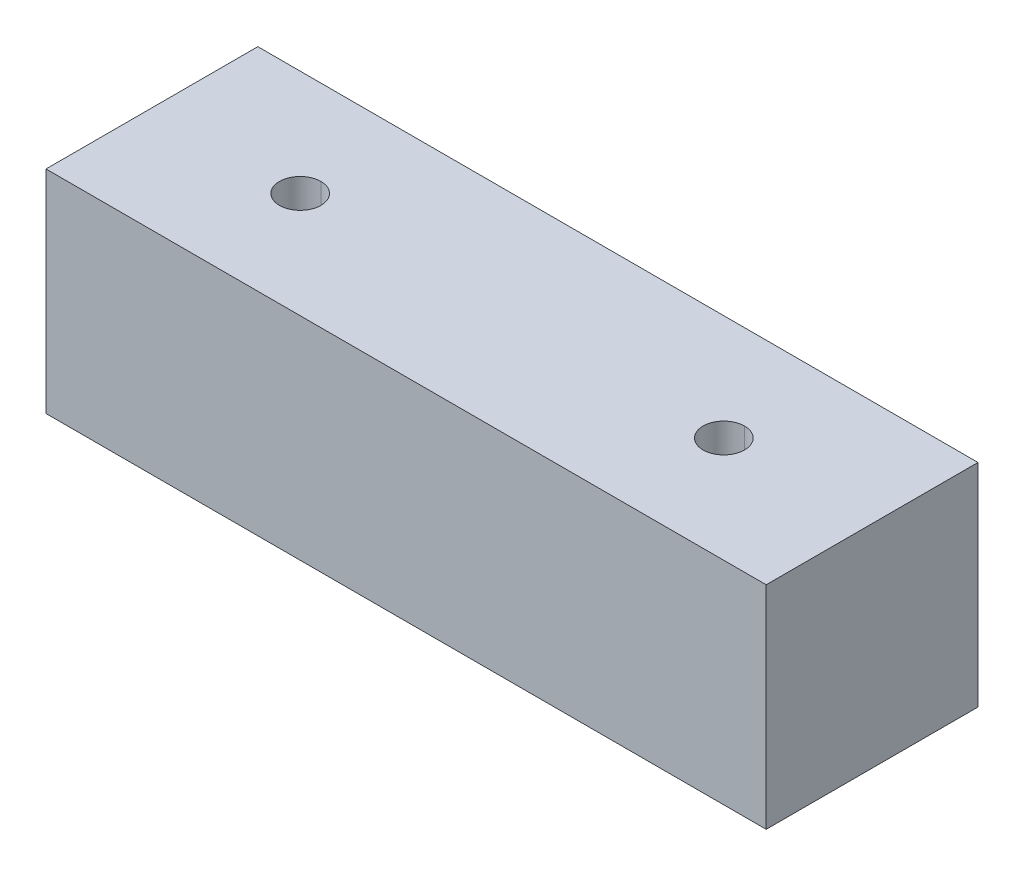
ISO-10303-21;
HEADER;
FILE_DESCRIPTION(('STEP AP214'),'2;1');
FILE_NAME('part.step','',(''),(''),'','','');
FILE_SCHEMA(('AUTOMOTIVE_DESIGN { 1 0 10303 214 1 1 1 1 }'));
ENDSEC;
DATA;
#1=APPLICATION_CONTEXT('core data for automotive mechanical design processes');
#2=APPLICATION_PROTOCOL_DEFINITION('international standard','automotive_design',2000,#1);
#3=PRODUCT_CONTEXT('',#1,'mechanical');
#4=PRODUCT('Part','Part','',(#3));
#5=PRODUCT_RELATED_PRODUCT_CATEGORY('part','',(#4));
#6=PRODUCT_DEFINITION_FORMATION('','',#4);
#7=PRODUCT_DEFINITION_CONTEXT('part definition',#1,'design');
#8=PRODUCT_DEFINITION('design','',#6,#7);
#9=PRODUCT_DEFINITION_SHAPE('','',#8);
#10=(LENGTH_UNIT() NAMED_UNIT(*) SI_UNIT(.MILLI.,.METRE.));
#11=(NAMED_UNIT(*) PLANE_ANGLE_UNIT() SI_UNIT($,.RADIAN.));
#12=(NAMED_UNIT(*) SI_UNIT($,.STERADIAN.) SOLID_ANGLE_UNIT());
#13=UNCERTAINTY_MEASURE_WITH_UNIT(LENGTH_MEASURE(1.E-05),#10,'distance_accuracy_value','');
#14=(GEOMETRIC_REPRESENTATION_CONTEXT(3) GLOBAL_UNCERTAINTY_ASSIGNED_CONTEXT((#13)) GLOBAL_UNIT_ASSIGNED_CONTEXT((#10,
#11,#12)) REPRESENTATION_CONTEXT('',''));
#15=CARTESIAN_POINT('',(0.,0.,0.));
#16=DIRECTION('',(0.,0.,1.));
#17=DIRECTION('',(1.,0.,0.));
#18=AXIS2_PLACEMENT_3D('',#15,#16,#17);
#19=CARTESIAN_POINT('',(-25.4,50.1094792010818,317.5));
#20=DIRECTION('',(0.,1.,0.));
#21=DIRECTION('',(0.,0.,1.));
#22=AXIS2_PLACEMENT_3D('',#19,#20,#21);
#23=CYLINDRICAL_SURFACE('',#22,2.48920000000003);
#24=DIRECTION('',(0.,1.,0.));
#25=VECTOR('',#24,1.);
#26=CARTESIAN_POINT('',(-25.4,50.1094792010818,315.0108));
#27=LINE('',#26,#25);
#28=CARTESIAN_POINT('',(-25.4,57.15,315.0108));
#29=VERTEX_POINT('',#28);
#30=CARTESIAN_POINT('',(-25.4,82.55,315.0108));
#31=VERTEX_POINT('',#30);
#32=EDGE_CURVE('E168',#29,#31,#27,.T.);
#33=ORIENTED_EDGE('',*,*,#32,.F.);
#34=CARTESIAN_POINT('',(-25.4,57.15,317.5));
#35=DIRECTION('',(0.,1.,0.));
#36=DIRECTION('',(0.,0.,-1.));
#37=AXIS2_PLACEMENT_3D('',#34,#35,#36);
#38=CIRCLE('',#37,2.48920000000003);
#39=CARTESIAN_POINT('',(-25.4,57.15,319.9892));
#40=VERTEX_POINT('',#39);
#41=EDGE_CURVE('E28',#40,#29,#38,.T.);
#42=ORIENTED_EDGE('',*,*,#41,.F.);
#43=DIRECTION('',(0.,1.,0.));
#44=VECTOR('',#43,1.);
#45=CARTESIAN_POINT('',(-25.4,50.1094792010818,319.9892));
#46=LINE('',#45,#44);
#47=CARTESIAN_POINT('',(-25.4,82.55,319.9892));
#48=VERTEX_POINT('',#47);
#49=EDGE_CURVE('E141',#40,#48,#46,.T.);
#50=ORIENTED_EDGE('',*,*,#49,.T.);
#51=CARTESIAN_POINT('',(-25.4,82.55,317.5));
#52=DIRECTION('',(0.,1.,0.));
#53=DIRECTION('',(0.,0.,1.));
#54=AXIS2_PLACEMENT_3D('',#51,#52,#53);
#55=CIRCLE('',#54,2.48920000000003);
#56=EDGE_CURVE('E159',#48,#31,#55,.T.);
#57=ORIENTED_EDGE('',*,*,#56,.T.);
#58=EDGE_LOOP('',(#33,#42,#50,#57));
#59=FACE_BOUND('',#58,.T.);
#60=ADVANCED_FACE('F17',(#59),#23,.F.);
#61=CARTESIAN_POINT('',(25.4,50.1094792010818,317.5));
#62=DIRECTION('',(0.,1.,0.));
#63=DIRECTION('',(0.,0.,1.));
#64=AXIS2_PLACEMENT_3D('',#61,#62,#63);
#65=CYLINDRICAL_SURFACE('',#64,2.48920000000003);
#66=DIRECTION('',(0.,1.,0.));
#67=VECTOR('',#66,1.);
#68=CARTESIAN_POINT('',(25.4,50.1094792010818,315.0108));
#69=LINE('',#68,#67);
#70=CARTESIAN_POINT('',(25.4,57.15,315.0108));
#71=VERTEX_POINT('',#70);
#72=CARTESIAN_POINT('',(25.4,82.55,315.0108));
#73=VERTEX_POINT('',#72);
#74=EDGE_CURVE('E129',#71,#73,#69,.T.);
#75=ORIENTED_EDGE('',*,*,#74,.F.);
#76=CARTESIAN_POINT('',(25.4,57.15,317.5));
#77=DIRECTION('',(0.,1.,0.));
#78=DIRECTION('',(0.,0.,-1.));
#79=AXIS2_PLACEMENT_3D('',#76,#77,#78);
#80=CIRCLE('',#79,2.48920000000003);
#81=CARTESIAN_POINT('',(25.4,57.15,319.9892));
#82=VERTEX_POINT('',#81);
#83=EDGE_CURVE('E11',#82,#71,#80,.T.);
#84=ORIENTED_EDGE('',*,*,#83,.F.);
#85=DIRECTION('',(0.,1.,0.));
#86=VECTOR('',#85,1.);
#87=CARTESIAN_POINT('',(25.4,50.1094792010818,319.9892));
#88=LINE('',#87,#86);
#89=CARTESIAN_POINT('',(25.4,82.55,319.9892));
#90=VERTEX_POINT('',#89);
#91=EDGE_CURVE('E139',#82,#90,#88,.T.);
#92=ORIENTED_EDGE('',*,*,#91,.T.);
#93=CARTESIAN_POINT('',(25.4,82.55,317.5));
#94=DIRECTION('',(0.,1.,0.));
#95=DIRECTION('',(0.,0.,1.));
#96=AXIS2_PLACEMENT_3D('',#93,#94,#95);
#97=CIRCLE('',#96,2.48920000000003);
#98=EDGE_CURVE('E131',#90,#73,#97,.T.);
#99=ORIENTED_EDGE('',*,*,#98,.T.);
#100=EDGE_LOOP('',(#75,#84,#92,#99));
#101=FACE_BOUND('',#100,.T.);
#102=ADVANCED_FACE('F130',(#101),#65,.F.);
#103=CARTESIAN_POINT('',(0.,57.15,0.));
#104=DIRECTION('',(0.,-1.,0.));
#105=DIRECTION('',(0.,0.,-1.));
#106=AXIS2_PLACEMENT_3D('',#103,#104,#105);
#107=PLANE('',#106);
#108=ORIENTED_EDGE('',*,*,#83,.T.);
#109=CARTESIAN_POINT('',(25.4,57.15,317.5));
#110=DIRECTION('',(0.,1.,0.));
#111=DIRECTION('',(0.,0.,-1.));
#112=AXIS2_PLACEMENT_3D('',#109,#110,#111);
#113=CIRCLE('',#112,2.48920000000003);
#114=EDGE_CURVE('E124',#71,#82,#113,.T.);
#115=ORIENTED_EDGE('',*,*,#114,.T.);
#116=EDGE_LOOP('',(#108,#115));
#117=FACE_BOUND('',#116,.T.);
#118=ORIENTED_EDGE('',*,*,#41,.T.);
#119=CARTESIAN_POINT('',(-25.4,57.15,317.5));
#120=DIRECTION('',(0.,1.,0.));
#121=DIRECTION('',(0.,0.,-1.));
#122=AXIS2_PLACEMENT_3D('',#119,#120,#121);
#123=CIRCLE('',#122,2.48920000000003);
#124=EDGE_CURVE('E164',#29,#40,#123,.T.);
#125=ORIENTED_EDGE('',*,*,#124,.T.);
#126=EDGE_LOOP('',(#118,#125));
#127=FACE_BOUND('',#126,.T.);
#128=DIRECTION('',(0.,0.,-1.));
#129=VECTOR('',#128,1.);
#130=CARTESIAN_POINT('',(43.18,57.15,330.2));
#131=LINE('',#130,#129);
#132=CARTESIAN_POINT('',(43.18,57.15,330.2));
#133=VERTEX_POINT('',#132);
#134=CARTESIAN_POINT('',(43.18,57.15,304.8));
#135=VERTEX_POINT('',#134);
#136=EDGE_CURVE('E155',#133,#135,#131,.T.);
#137=ORIENTED_EDGE('',*,*,#136,.F.);
#138=DIRECTION('',(1.,0.,0.));
#139=VECTOR('',#138,1.);
#140=CARTESIAN_POINT('',(-43.18,57.15,330.2));
#141=LINE('',#140,#139);
#142=CARTESIAN_POINT('',(-43.18,57.15,330.2));
#143=VERTEX_POINT('',#142);
#144=EDGE_CURVE('E81',#143,#133,#141,.T.);
#145=ORIENTED_EDGE('',*,*,#144,.F.);
#146=DIRECTION('',(0.,0.,1.));
#147=VECTOR('',#146,1.);
#148=CARTESIAN_POINT('',(-43.18,57.15,330.2));
#149=LINE('',#148,#147);
#150=CARTESIAN_POINT('',(-43.18,57.15,304.8));
#151=VERTEX_POINT('',#150);
#152=EDGE_CURVE('E21',#151,#143,#149,.T.);
#153=ORIENTED_EDGE('',*,*,#152,.F.);
#154=DIRECTION('',(-1.,0.,0.));
#155=VECTOR('',#154,1.);
#156=CARTESIAN_POINT('',(-43.18,57.15,304.8));
#157=LINE('',#156,#155);
#158=EDGE_CURVE('E73',#135,#151,#157,.T.);
#159=ORIENTED_EDGE('',*,*,#158,.F.);
#160=EDGE_LOOP('',(#137,#145,#153,#159));
#161=FACE_BOUND('',#160,.T.);
#162=ADVANCED_FACE('F19',(#117,#127,#161),#107,.T.);
#163=CARTESIAN_POINT('',(0.,82.55,0.));
#164=DIRECTION('',(0.,-1.,0.));
#165=DIRECTION('',(0.,0.,-1.));
#166=AXIS2_PLACEMENT_3D('',#163,#164,#165);
#167=PLANE('',#166);
#168=ORIENTED_EDGE('',*,*,#98,.F.);
#169=CARTESIAN_POINT('',(25.4,82.55,317.5));
#170=DIRECTION('',(0.,1.,0.));
#171=DIRECTION('',(0.,0.,1.));
#172=AXIS2_PLACEMENT_3D('',#169,#170,#171);
#173=CIRCLE('',#172,2.48920000000003);
#174=EDGE_CURVE('E136',#73,#90,#173,.T.);
#175=ORIENTED_EDGE('',*,*,#174,.F.);
#176=EDGE_LOOP('',(#168,#175));
#177=FACE_BOUND('',#176,.T.);
#178=ORIENTED_EDGE('',*,*,#56,.F.);
#179=CARTESIAN_POINT('',(-25.4,82.55,317.5));
#180=DIRECTION('',(0.,1.,0.));
#181=DIRECTION('',(0.,0.,1.));
#182=AXIS2_PLACEMENT_3D('',#179,#180,#181);
#183=CIRCLE('',#182,2.48920000000003);
#184=EDGE_CURVE('E149',#31,#48,#183,.T.);
#185=ORIENTED_EDGE('',*,*,#184,.F.);
#186=EDGE_LOOP('',(#178,#185));
#187=FACE_BOUND('',#186,.T.);
#188=DIRECTION('',(0.,0.,-1.));
#189=VECTOR('',#188,1.);
#190=CARTESIAN_POINT('',(43.18,82.55,330.2));
#191=LINE('',#190,#189);
#192=CARTESIAN_POINT('',(43.18,82.55,330.2));
#193=VERTEX_POINT('',#192);
#194=CARTESIAN_POINT('',(43.18,82.55,304.8));
#195=VERTEX_POINT('',#194);
#196=EDGE_CURVE('E153',#193,#195,#191,.T.);
#197=ORIENTED_EDGE('',*,*,#196,.T.);
#198=DIRECTION('',(-1.,0.,0.));
#199=VECTOR('',#198,1.);
#200=CARTESIAN_POINT('',(-43.18,82.55,304.8));
#201=LINE('',#200,#199);
#202=CARTESIAN_POINT('',(-43.18,82.55,304.8));
#203=VERTEX_POINT('',#202);
#204=EDGE_CURVE('E59',#195,#203,#201,.T.);
#205=ORIENTED_EDGE('',*,*,#204,.T.);
#206=DIRECTION('',(0.,0.,1.));
#207=VECTOR('',#206,1.);
#208=CARTESIAN_POINT('',(-43.18,82.55,330.2));
#209=LINE('',#208,#207);
#210=CARTESIAN_POINT('',(-43.18,82.55,330.2));
#211=VERTEX_POINT('',#210);
#212=EDGE_CURVE('E193',#203,#211,#209,.T.);
#213=ORIENTED_EDGE('',*,*,#212,.T.);
#214=DIRECTION('',(1.,0.,0.));
#215=VECTOR('',#214,1.);
#216=CARTESIAN_POINT('',(-43.18,82.55,330.2));
#217=LINE('',#216,#215);
#218=EDGE_CURVE('E43',#211,#193,#217,.T.);
#219=ORIENTED_EDGE('',*,*,#218,.T.);
#220=EDGE_LOOP('',(#197,#205,#213,#219));
#221=FACE_BOUND('',#220,.T.);
#222=ADVANCED_FACE('F219',(#177,#187,#221),#167,.F.);
#223=CARTESIAN_POINT('',(-43.18,82.55,330.2));
#224=DIRECTION('',(0.,0.,-1.));
#225=DIRECTION('',(0.,-1.,0.));
#226=AXIS2_PLACEMENT_3D('',#223,#224,#225);
#227=PLANE('',#226);
#228=ORIENTED_EDGE('',*,*,#144,.T.);
#229=DIRECTION('',(0.,-1.,0.));
#230=VECTOR('',#229,1.);
#231=CARTESIAN_POINT('',(43.18,82.55,330.2));
#232=LINE('',#231,#230);
#233=EDGE_CURVE('E177',#193,#133,#232,.T.);
#234=ORIENTED_EDGE('',*,*,#233,.F.);
#235=ORIENTED_EDGE('',*,*,#218,.F.);
#236=DIRECTION('',(0.,-1.,0.));
#237=VECTOR('',#236,1.);
#238=CARTESIAN_POINT('',(-43.18,82.55,330.2));
#239=LINE('',#238,#237);
#240=EDGE_CURVE('E184',#211,#143,#239,.T.);
#241=ORIENTED_EDGE('',*,*,#240,.T.);
#242=EDGE_LOOP('',(#228,#234,#235,#241));
#243=FACE_BOUND('',#242,.T.);
#244=ADVANCED_FACE('F221',(#243),#227,.F.);
#245=CARTESIAN_POINT('',(-43.18,82.55,330.2));
#246=DIRECTION('',(1.,0.,0.));
#247=DIRECTION('',(0.,1.,0.));
#248=AXIS2_PLACEMENT_3D('',#245,#246,#247);
#249=PLANE('',#248);
#250=ORIENTED_EDGE('',*,*,#152,.T.);
#251=ORIENTED_EDGE('',*,*,#240,.F.);
#252=ORIENTED_EDGE('',*,*,#212,.F.);
#253=DIRECTION('',(0.,-1.,0.));
#254=VECTOR('',#253,1.);
#255=CARTESIAN_POINT('',(-43.18,82.55,304.8));
#256=LINE('',#255,#254);
#257=EDGE_CURVE('E176',#203,#151,#256,.T.);
#258=ORIENTED_EDGE('',*,*,#257,.T.);
#259=EDGE_LOOP('',(#250,#251,#252,#258));
#260=FACE_BOUND('',#259,.T.);
#261=ADVANCED_FACE('F230',(#260),#249,.F.);
#262=CARTESIAN_POINT('',(-43.18,82.55,304.8));
#263=DIRECTION('',(0.,0.,1.));
#264=DIRECTION('',(1.,0.,0.));
#265=AXIS2_PLACEMENT_3D('',#262,#263,#264);
#266=PLANE('',#265);
#267=ORIENTED_EDGE('',*,*,#158,.T.);
#268=ORIENTED_EDGE('',*,*,#257,.F.);
#269=ORIENTED_EDGE('',*,*,#204,.F.);
#270=DIRECTION('',(0.,-1.,0.));
#271=VECTOR('',#270,1.);
#272=CARTESIAN_POINT('',(43.18,82.55,304.8));
#273=LINE('',#272,#271);
#274=EDGE_CURVE('E158',#195,#135,#273,.T.);
#275=ORIENTED_EDGE('',*,*,#274,.T.);
#276=EDGE_LOOP('',(#267,#268,#269,#275));
#277=FACE_BOUND('',#276,.T.);
#278=ADVANCED_FACE('F228',(#277),#266,.F.);
#279=CARTESIAN_POINT('',(43.18,82.55,330.2));
#280=DIRECTION('',(-1.,0.,0.));
#281=DIRECTION('',(0.,0.,1.));
#282=AXIS2_PLACEMENT_3D('',#279,#280,#281);
#283=PLANE('',#282);
#284=ORIENTED_EDGE('',*,*,#136,.T.);
#285=ORIENTED_EDGE('',*,*,#274,.F.);
#286=ORIENTED_EDGE('',*,*,#196,.F.);
#287=ORIENTED_EDGE('',*,*,#233,.T.);
#288=EDGE_LOOP('',(#284,#285,#286,#287));
#289=FACE_BOUND('',#288,.T.);
#290=ADVANCED_FACE('F227',(#289),#283,.F.);
#291=CARTESIAN_POINT('',(25.4,50.1094792010818,317.5));
#292=DIRECTION('',(0.,1.,0.));
#293=DIRECTION('',(0.,0.,1.));
#294=AXIS2_PLACEMENT_3D('',#291,#292,#293);
#295=CYLINDRICAL_SURFACE('',#294,2.48920000000003);
#296=ORIENTED_EDGE('',*,*,#114,.F.);
#297=ORIENTED_EDGE('',*,*,#74,.T.);
#298=ORIENTED_EDGE('',*,*,#174,.T.);
#299=ORIENTED_EDGE('',*,*,#91,.F.);
#300=EDGE_LOOP('',(#296,#297,#298,#299));
#301=FACE_BOUND('',#300,.T.);
#302=ADVANCED_FACE('F138',(#301),#295,.F.);
#303=CARTESIAN_POINT('',(-25.4,50.1094792010818,317.5));
#304=DIRECTION('',(0.,1.,0.));
#305=DIRECTION('',(0.,0.,1.));
#306=AXIS2_PLACEMENT_3D('',#303,#304,#305);
#307=CYLINDRICAL_SURFACE('',#306,2.48920000000003);
#308=ORIENTED_EDGE('',*,*,#124,.F.);
#309=ORIENTED_EDGE('',*,*,#32,.T.);
#310=ORIENTED_EDGE('',*,*,#184,.T.);
#311=ORIENTED_EDGE('',*,*,#49,.F.);
#312=EDGE_LOOP('',(#308,#309,#310,#311));
#313=FACE_BOUND('',#312,.T.);
#314=ADVANCED_FACE('F217',(#313),#307,.F.);
#315=CLOSED_SHELL('',(#60,#102,#162,#222,#244,#261,#278,#290,#302,#314));
#316=MANIFOLD_SOLID_BREP('B1',#315);
#317=ADVANCED_BREP_SHAPE_REPRESENTATION('',(#18,#316),#14);
#318=SHAPE_DEFINITION_REPRESENTATION(#9,#317);
ENDSEC;
END-ISO-10303-21;
